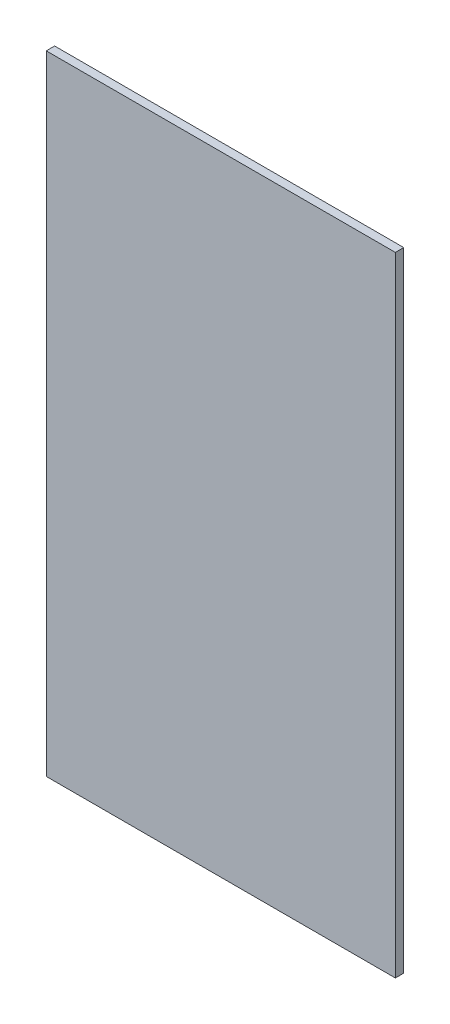
ISO-10303-21;
HEADER;
FILE_DESCRIPTION(('STEP AP214'),'2;1');
FILE_NAME('part.step','',(''),(''),'','','');
FILE_SCHEMA(('AUTOMOTIVE_DESIGN { 1 0 10303 214 1 1 1 1 }'));
ENDSEC;
DATA;
#1=APPLICATION_CONTEXT('core data for automotive mechanical design processes');
#2=APPLICATION_PROTOCOL_DEFINITION('international standard','automotive_design',2000,#1);
#3=PRODUCT_CONTEXT('',#1,'mechanical');
#4=PRODUCT('Part','Part','',(#3));
#5=PRODUCT_RELATED_PRODUCT_CATEGORY('part','',(#4));
#6=PRODUCT_DEFINITION_FORMATION('','',#4);
#7=PRODUCT_DEFINITION_CONTEXT('part definition',#1,'design');
#8=PRODUCT_DEFINITION('design','',#6,#7);
#9=PRODUCT_DEFINITION_SHAPE('','',#8);
#10=(LENGTH_UNIT() NAMED_UNIT(*) SI_UNIT(.MILLI.,.METRE.));
#11=(NAMED_UNIT(*) PLANE_ANGLE_UNIT() SI_UNIT($,.RADIAN.));
#12=(NAMED_UNIT(*) SI_UNIT($,.STERADIAN.) SOLID_ANGLE_UNIT());
#13=UNCERTAINTY_MEASURE_WITH_UNIT(LENGTH_MEASURE(1.E-05),#10,'distance_accuracy_value','');
#14=(GEOMETRIC_REPRESENTATION_CONTEXT(3) GLOBAL_UNCERTAINTY_ASSIGNED_CONTEXT((#13)) GLOBAL_UNIT_ASSIGNED_CONTEXT((#10,
#11,#12)) REPRESENTATION_CONTEXT('',''));
#15=CARTESIAN_POINT('',(0.,0.,0.));
#16=DIRECTION('',(0.,0.,1.));
#17=DIRECTION('',(1.,0.,0.));
#18=AXIS2_PLACEMENT_3D('',#15,#16,#17);
#19=CARTESIAN_POINT('',(125.,-225.,3.));
#20=DIRECTION('',(-1.,0.,0.));
#21=DIRECTION('',(0.,0.,1.));
#22=AXIS2_PLACEMENT_3D('',#19,#20,#21);
#23=PLANE('',#22);
#24=DIRECTION('',(0.,1.,0.));
#25=VECTOR('',#24,1.);
#26=CARTESIAN_POINT('',(125.,-225.,-3.));
#27=LINE('',#26,#25);
#28=CARTESIAN_POINT('',(125.,-225.,-3.));
#29=VERTEX_POINT('',#28);
#30=CARTESIAN_POINT('',(125.,225.,-3.));
#31=VERTEX_POINT('',#30);
#32=EDGE_CURVE('E103',#29,#31,#27,.T.);
#33=ORIENTED_EDGE('',*,*,#32,.T.);
#34=DIRECTION('',(0.,0.,-1.));
#35=VECTOR('',#34,1.);
#36=CARTESIAN_POINT('',(125.,225.,3.));
#37=LINE('',#36,#35);
#38=CARTESIAN_POINT('',(125.,225.,3.));
#39=VERTEX_POINT('',#38);
#40=EDGE_CURVE('E11',#39,#31,#37,.T.);
#41=ORIENTED_EDGE('',*,*,#40,.F.);
#42=DIRECTION('',(0.,1.,0.));
#43=VECTOR('',#42,1.);
#44=CARTESIAN_POINT('',(125.,-225.,3.));
#45=LINE('',#44,#43);
#46=CARTESIAN_POINT('',(125.,-225.,3.));
#47=VERTEX_POINT('',#46);
#48=EDGE_CURVE('E91',#47,#39,#45,.T.);
#49=ORIENTED_EDGE('',*,*,#48,.F.);
#50=DIRECTION('',(0.,0.,-1.));
#51=VECTOR('',#50,1.);
#52=CARTESIAN_POINT('',(125.,-225.,3.));
#53=LINE('',#52,#51);
#54=EDGE_CURVE('E99',#47,#29,#53,.T.);
#55=ORIENTED_EDGE('',*,*,#54,.T.);
#56=EDGE_LOOP('',(#33,#41,#49,#55));
#57=FACE_BOUND('',#56,.T.);
#58=ADVANCED_FACE('F40',(#57),#23,.F.);
#59=CARTESIAN_POINT('',(-125.,225.,3.));
#60=DIRECTION('',(0.,-1.,0.));
#61=DIRECTION('',(0.,0.,-1.));
#62=AXIS2_PLACEMENT_3D('',#59,#60,#61);
#63=PLANE('',#62);
#64=DIRECTION('',(-1.,0.,0.));
#65=VECTOR('',#64,1.);
#66=CARTESIAN_POINT('',(-125.,225.,-3.));
#67=LINE('',#66,#65);
#68=CARTESIAN_POINT('',(-125.,225.,-3.));
#69=VERTEX_POINT('',#68);
#70=EDGE_CURVE('E95',#31,#69,#67,.T.);
#71=ORIENTED_EDGE('',*,*,#70,.T.);
#72=DIRECTION('',(0.,0.,-1.));
#73=VECTOR('',#72,1.);
#74=CARTESIAN_POINT('',(-125.,225.,3.));
#75=LINE('',#74,#73);
#76=CARTESIAN_POINT('',(-125.,225.,3.));
#77=VERTEX_POINT('',#76);
#78=EDGE_CURVE('E48',#77,#69,#75,.T.);
#79=ORIENTED_EDGE('',*,*,#78,.F.);
#80=DIRECTION('',(-1.,0.,0.));
#81=VECTOR('',#80,1.);
#82=CARTESIAN_POINT('',(-125.,225.,3.));
#83=LINE('',#82,#81);
#84=EDGE_CURVE('E86',#39,#77,#83,.T.);
#85=ORIENTED_EDGE('',*,*,#84,.F.);
#86=ORIENTED_EDGE('',*,*,#40,.T.);
#87=EDGE_LOOP('',(#71,#79,#85,#86));
#88=FACE_BOUND('',#87,.T.);
#89=ADVANCED_FACE('F94',(#88),#63,.F.);
#90=CARTESIAN_POINT('',(-125.,-225.,3.));
#91=DIRECTION('',(1.,0.,0.));
#92=DIRECTION('',(0.,0.,-1.));
#93=AXIS2_PLACEMENT_3D('',#90,#91,#92);
#94=PLANE('',#93);
#95=DIRECTION('',(0.,-1.,0.));
#96=VECTOR('',#95,1.);
#97=CARTESIAN_POINT('',(-125.,-225.,-3.));
#98=LINE('',#97,#96);
#99=CARTESIAN_POINT('',(-125.,-225.,-3.));
#100=VERTEX_POINT('',#99);
#101=EDGE_CURVE('E73',#69,#100,#98,.T.);
#102=ORIENTED_EDGE('',*,*,#101,.T.);
#103=DIRECTION('',(0.,0.,-1.));
#104=VECTOR('',#103,1.);
#105=CARTESIAN_POINT('',(-125.,-225.,3.));
#106=LINE('',#105,#104);
#107=CARTESIAN_POINT('',(-125.,-225.,3.));
#108=VERTEX_POINT('',#107);
#109=EDGE_CURVE('E96',#108,#100,#106,.T.);
#110=ORIENTED_EDGE('',*,*,#109,.F.);
#111=DIRECTION('',(0.,-1.,0.));
#112=VECTOR('',#111,1.);
#113=CARTESIAN_POINT('',(-125.,-225.,3.));
#114=LINE('',#113,#112);
#115=EDGE_CURVE('E89',#77,#108,#114,.T.);
#116=ORIENTED_EDGE('',*,*,#115,.F.);
#117=ORIENTED_EDGE('',*,*,#78,.T.);
#118=EDGE_LOOP('',(#102,#110,#116,#117));
#119=FACE_BOUND('',#118,.T.);
#120=ADVANCED_FACE('F97',(#119),#94,.F.);
#121=CARTESIAN_POINT('',(-125.,-225.,3.));
#122=DIRECTION('',(0.,1.,0.));
#123=DIRECTION('',(0.,0.,1.));
#124=AXIS2_PLACEMENT_3D('',#121,#122,#123);
#125=PLANE('',#124);
#126=DIRECTION('',(1.,0.,0.));
#127=VECTOR('',#126,1.);
#128=CARTESIAN_POINT('',(-125.,-225.,-3.));
#129=LINE('',#128,#127);
#130=EDGE_CURVE('E79',#100,#29,#129,.T.);
#131=ORIENTED_EDGE('',*,*,#130,.T.);
#132=ORIENTED_EDGE('',*,*,#54,.F.);
#133=DIRECTION('',(1.,0.,0.));
#134=VECTOR('',#133,1.);
#135=CARTESIAN_POINT('',(-125.,-225.,3.));
#136=LINE('',#135,#134);
#137=EDGE_CURVE('E56',#108,#47,#136,.T.);
#138=ORIENTED_EDGE('',*,*,#137,.F.);
#139=ORIENTED_EDGE('',*,*,#109,.T.);
#140=EDGE_LOOP('',(#131,#132,#138,#139));
#141=FACE_BOUND('',#140,.T.);
#142=ADVANCED_FACE('F111',(#141),#125,.F.);
#143=CARTESIAN_POINT('',(0.,0.,3.));
#144=DIRECTION('',(0.,0.,-1.));
#145=DIRECTION('',(-1.,0.,0.));
#146=AXIS2_PLACEMENT_3D('',#143,#144,#145);
#147=PLANE('',#146);
#148=ORIENTED_EDGE('',*,*,#48,.T.);
#149=ORIENTED_EDGE('',*,*,#84,.T.);
#150=ORIENTED_EDGE('',*,*,#115,.T.);
#151=ORIENTED_EDGE('',*,*,#137,.T.);
#152=EDGE_LOOP('',(#148,#149,#150,#151));
#153=FACE_BOUND('',#152,.T.);
#154=ADVANCED_FACE('F87',(#153),#147,.F.);
#155=CARTESIAN_POINT('',(0.,0.,-3.));
#156=DIRECTION('',(0.,0.,-1.));
#157=DIRECTION('',(-1.,0.,0.));
#158=AXIS2_PLACEMENT_3D('',#155,#156,#157);
#159=PLANE('',#158);
#160=ORIENTED_EDGE('',*,*,#32,.F.);
#161=ORIENTED_EDGE('',*,*,#130,.F.);
#162=ORIENTED_EDGE('',*,*,#101,.F.);
#163=ORIENTED_EDGE('',*,*,#70,.F.);
#164=EDGE_LOOP('',(#160,#161,#162,#163));
#165=FACE_BOUND('',#164,.T.);
#166=ADVANCED_FACE('F114',(#165),#159,.T.);
#167=CLOSED_SHELL('',(#58,#89,#120,#142,#154,#166));
#168=MANIFOLD_SOLID_BREP('B2',#167);
#169=ADVANCED_BREP_SHAPE_REPRESENTATION('',(#18,#168),#14);
#170=SHAPE_DEFINITION_REPRESENTATION(#9,#169);
ENDSEC;
END-ISO-10303-21;
